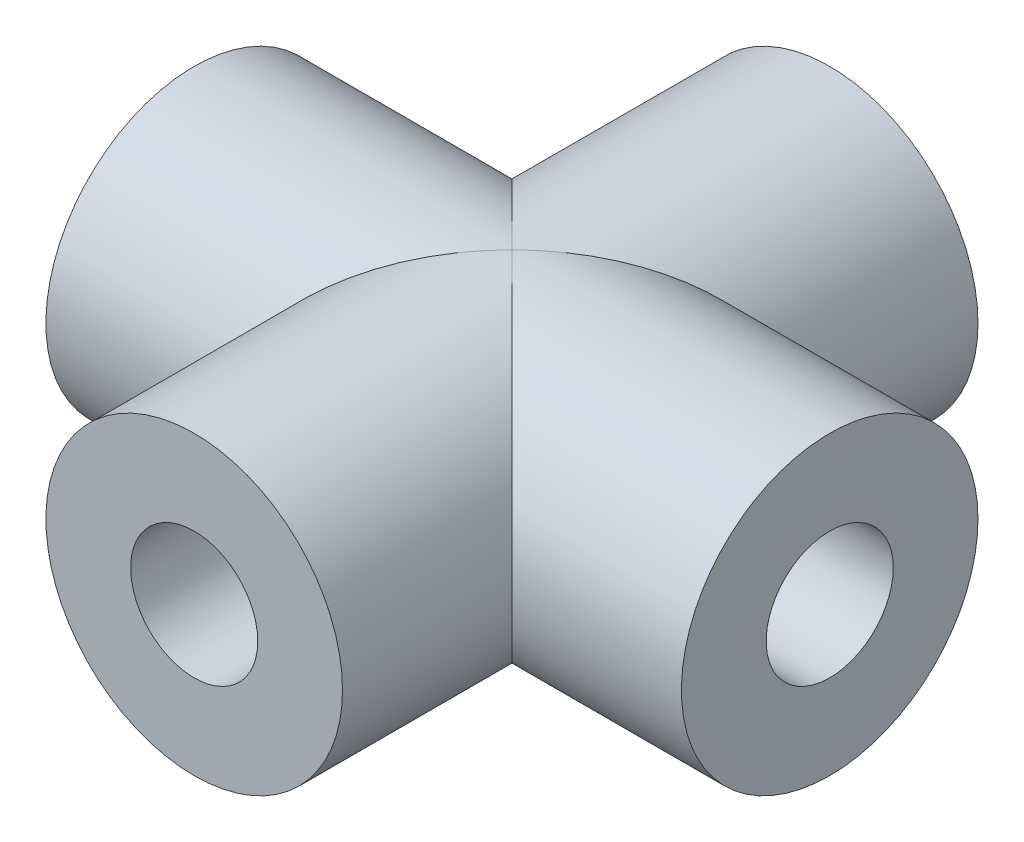
ISO-10303-21;
HEADER;
FILE_DESCRIPTION(('STEP AP214'),'2;1');
FILE_NAME('part.step','',(''),(''),'','','');
FILE_SCHEMA(('AUTOMOTIVE_DESIGN { 1 0 10303 214 1 1 1 1 }'));
ENDSEC;
DATA;
#1=APPLICATION_CONTEXT('core data for automotive mechanical design processes');
#2=APPLICATION_PROTOCOL_DEFINITION('international standard','automotive_design',2000,#1);
#3=PRODUCT_CONTEXT('',#1,'mechanical');
#4=PRODUCT('Part','Part','',(#3));
#5=PRODUCT_RELATED_PRODUCT_CATEGORY('part','',(#4));
#6=PRODUCT_DEFINITION_FORMATION('','',#4);
#7=PRODUCT_DEFINITION_CONTEXT('part definition',#1,'design');
#8=PRODUCT_DEFINITION('design','',#6,#7);
#9=PRODUCT_DEFINITION_SHAPE('','',#8);
#10=(LENGTH_UNIT() NAMED_UNIT(*) SI_UNIT(.MILLI.,.METRE.));
#11=(NAMED_UNIT(*) PLANE_ANGLE_UNIT() SI_UNIT($,.RADIAN.));
#12=(NAMED_UNIT(*) SI_UNIT($,.STERADIAN.) SOLID_ANGLE_UNIT());
#13=UNCERTAINTY_MEASURE_WITH_UNIT(LENGTH_MEASURE(1.E-05),#10,'distance_accuracy_value','');
#14=(GEOMETRIC_REPRESENTATION_CONTEXT(3) GLOBAL_UNCERTAINTY_ASSIGNED_CONTEXT((#13)) GLOBAL_UNIT_ASSIGNED_CONTEXT((#10,
#11,#12)) REPRESENTATION_CONTEXT('',''));
#15=CARTESIAN_POINT('',(0.,0.,0.));
#16=DIRECTION('',(0.,0.,1.));
#17=DIRECTION('',(1.,0.,0.));
#18=AXIS2_PLACEMENT_3D('',#15,#16,#17);
#19=CARTESIAN_POINT('',(0.,0.,15.));
#20=DIRECTION('',(0.,0.,-1.));
#21=DIRECTION('',(-1.,0.,0.));
#22=AXIS2_PLACEMENT_3D('',#19,#20,#21);
#23=CYLINDRICAL_SURFACE('',#22,7.);
#24=CARTESIAN_POINT('',(0.,0.,15.));
#25=DIRECTION('',(0.,0.,1.));
#26=DIRECTION('',(1.,0.,0.));
#27=AXIS2_PLACEMENT_3D('',#24,#25,#26);
#28=CIRCLE('',#27,7.);
#29=CARTESIAN_POINT('',(7.,0.,15.));
#30=VERTEX_POINT('',#29);
#31=EDGE_CURVE('E56',#30,#30,#28,.T.);
#32=ORIENTED_EDGE('',*,*,#31,.F.);
#33=EDGE_LOOP('',(#32));
#34=FACE_BOUND('',#33,.T.);
#35=CARTESIAN_POINT('',(0.,0.,0.));
#36=DIRECTION('',(-0.707106781186547,0.,-0.707106781186547));
#37=DIRECTION('',(0.707106781186547,0.,-0.707106781186547));
#38=AXIS2_PLACEMENT_3D('',#35,#36,#37);
#39=ELLIPSE('',#38,9.89949493661167,7.);
#40=CARTESIAN_POINT('',(0.,-7.,0.));
#41=VERTEX_POINT('',#40);
#42=CARTESIAN_POINT('',(0.,7.,0.));
#43=VERTEX_POINT('',#42);
#44=EDGE_CURVE('E40',#41,#43,#39,.T.);
#45=ORIENTED_EDGE('',*,*,#44,.F.);
#46=CARTESIAN_POINT('',(0.,0.,0.));
#47=DIRECTION('',(0.707106781186547,0.,-0.707106781186547));
#48=DIRECTION('',(-0.707106781186547,0.,-0.707106781186547));
#49=AXIS2_PLACEMENT_3D('',#46,#47,#48);
#50=ELLIPSE('',#49,9.89949493661167,7.);
#51=EDGE_CURVE('E52',#43,#41,#50,.T.);
#52=ORIENTED_EDGE('',*,*,#51,.F.);
#53=EDGE_LOOP('',(#45,#52));
#54=FACE_BOUND('',#53,.T.);
#55=ADVANCED_FACE('F32',(#34,#54),#23,.T.);
#56=CARTESIAN_POINT('',(0.,0.,15.));
#57=DIRECTION('',(0.,0.,1.));
#58=DIRECTION('',(1.,0.,0.));
#59=AXIS2_PLACEMENT_3D('',#56,#57,#58);
#60=PLANE('',#59);
#61=CARTESIAN_POINT('',(0.,0.,15.));
#62=DIRECTION('',(0.,0.,1.));
#63=DIRECTION('',(1.,0.,0.));
#64=AXIS2_PLACEMENT_3D('',#61,#62,#63);
#65=CIRCLE('',#64,3.);
#66=CARTESIAN_POINT('',(3.,0.,15.));
#67=VERTEX_POINT('',#66);
#68=EDGE_CURVE('E101',#67,#67,#65,.T.);
#69=ORIENTED_EDGE('',*,*,#68,.F.);
#70=EDGE_LOOP('',(#69));
#71=FACE_BOUND('',#70,.T.);
#72=ORIENTED_EDGE('',*,*,#31,.T.);
#73=EDGE_LOOP('',(#72));
#74=FACE_BOUND('',#73,.T.);
#75=ADVANCED_FACE('F80',(#71,#74),#60,.T.);
#76=CARTESIAN_POINT('',(-15.,0.,0.));
#77=DIRECTION('',(1.,0.,0.));
#78=DIRECTION('',(0.,0.,-1.));
#79=AXIS2_PLACEMENT_3D('',#76,#77,#78);
#80=PLANE('',#79);
#81=CARTESIAN_POINT('',(-15.,0.,0.));
#82=DIRECTION('',(-1.,0.,0.));
#83=DIRECTION('',(0.,0.,1.));
#84=AXIS2_PLACEMENT_3D('',#81,#82,#83);
#85=CIRCLE('',#84,3.);
#86=CARTESIAN_POINT('',(-15.,0.,2.99999999999995));
#87=VERTEX_POINT('',#86);
#88=EDGE_CURVE('E119',#87,#87,#85,.T.);
#89=ORIENTED_EDGE('',*,*,#88,.F.);
#90=EDGE_LOOP('',(#89));
#91=FACE_BOUND('',#90,.T.);
#92=CARTESIAN_POINT('',(-15.,0.,0.));
#93=DIRECTION('',(1.,0.,0.));
#94=DIRECTION('',(0.,0.,-1.));
#95=AXIS2_PLACEMENT_3D('',#92,#93,#94);
#96=CIRCLE('',#95,7.);
#97=CARTESIAN_POINT('',(-15.,0.,-7.));
#98=VERTEX_POINT('',#97);
#99=EDGE_CURVE('E95',#98,#98,#96,.T.);
#100=ORIENTED_EDGE('',*,*,#99,.F.);
#101=EDGE_LOOP('',(#100));
#102=FACE_BOUND('',#101,.T.);
#103=ADVANCED_FACE('F77',(#91,#102),#80,.F.);
#104=CARTESIAN_POINT('',(15.,0.,0.));
#105=DIRECTION('',(-1.,0.,0.));
#106=DIRECTION('',(0.,0.,1.));
#107=AXIS2_PLACEMENT_3D('',#104,#105,#106);
#108=CYLINDRICAL_SURFACE('',#107,7.);
#109=ORIENTED_EDGE('',*,*,#99,.T.);
#110=EDGE_LOOP('',(#109));
#111=FACE_BOUND('',#110,.T.);
#112=CARTESIAN_POINT('',(0.,0.,0.));
#113=DIRECTION('',(0.707106781186547,0.,-0.707106781186547));
#114=DIRECTION('',(-0.707106781186547,0.,-0.707106781186547));
#115=AXIS2_PLACEMENT_3D('',#112,#113,#114);
#116=ELLIPSE('',#115,9.89949493661167,7.);
#117=EDGE_CURVE('E46',#43,#41,#116,.F.);
#118=ORIENTED_EDGE('',*,*,#117,.T.);
#119=ORIENTED_EDGE('',*,*,#44,.T.);
#120=EDGE_LOOP('',(#118,#119));
#121=FACE_BOUND('',#120,.T.);
#122=ADVANCED_FACE('F58',(#111,#121),#108,.T.);
#123=CARTESIAN_POINT('',(0.,0.,-15.));
#124=DIRECTION('',(0.,0.,1.));
#125=DIRECTION('',(1.,0.,0.));
#126=AXIS2_PLACEMENT_3D('',#123,#124,#125);
#127=PLANE('',#126);
#128=CARTESIAN_POINT('',(0.,0.,-15.));
#129=DIRECTION('',(0.,0.,-1.));
#130=DIRECTION('',(-1.,0.,0.));
#131=AXIS2_PLACEMENT_3D('',#128,#129,#130);
#132=CIRCLE('',#131,3.);
#133=CARTESIAN_POINT('',(-3.,0.,-15.));
#134=VERTEX_POINT('',#133);
#135=EDGE_CURVE('E113',#134,#134,#132,.T.);
#136=ORIENTED_EDGE('',*,*,#135,.F.);
#137=EDGE_LOOP('',(#136));
#138=FACE_BOUND('',#137,.T.);
#139=CARTESIAN_POINT('',(0.,0.,-15.));
#140=DIRECTION('',(0.,0.,1.));
#141=DIRECTION('',(1.,0.,0.));
#142=AXIS2_PLACEMENT_3D('',#139,#140,#141);
#143=CIRCLE('',#142,7.);
#144=CARTESIAN_POINT('',(7.,0.,-15.));
#145=VERTEX_POINT('',#144);
#146=EDGE_CURVE('E89',#145,#145,#143,.T.);
#147=ORIENTED_EDGE('',*,*,#146,.F.);
#148=EDGE_LOOP('',(#147));
#149=FACE_BOUND('',#148,.T.);
#150=ADVANCED_FACE('F71',(#138,#149),#127,.F.);
#151=ORIENTED_EDGE('',*,*,#146,.T.);
#152=EDGE_LOOP('',(#151));
#153=FACE_BOUND('',#152,.T.);
#154=CARTESIAN_POINT('',(0.,0.,0.));
#155=DIRECTION('',(-0.707106781186547,0.,-0.707106781186547));
#156=DIRECTION('',(0.707106781186547,0.,-0.707106781186547));
#157=AXIS2_PLACEMENT_3D('',#154,#155,#156);
#158=ELLIPSE('',#157,9.89949493661167,7.);
#159=EDGE_CURVE('E11',#41,#43,#158,.F.);
#160=ORIENTED_EDGE('',*,*,#159,.F.);
#161=ORIENTED_EDGE('',*,*,#117,.F.);
#162=EDGE_LOOP('',(#160,#161));
#163=FACE_BOUND('',#162,.T.);
#164=ADVANCED_FACE('F34',(#153,#163),#23,.T.);
#165=CARTESIAN_POINT('',(15.,0.,0.));
#166=DIRECTION('',(1.,0.,0.));
#167=DIRECTION('',(0.,0.,-1.));
#168=AXIS2_PLACEMENT_3D('',#165,#166,#167);
#169=CIRCLE('',#168,7.);
#170=CARTESIAN_POINT('',(15.,0.,-7.));
#171=VERTEX_POINT('',#170);
#172=EDGE_CURVE('E92',#171,#171,#169,.T.);
#173=ORIENTED_EDGE('',*,*,#172,.F.);
#174=EDGE_LOOP('',(#173));
#175=FACE_BOUND('',#174,.T.);
#176=ORIENTED_EDGE('',*,*,#51,.T.);
#177=ORIENTED_EDGE('',*,*,#159,.T.);
#178=EDGE_LOOP('',(#176,#177));
#179=FACE_BOUND('',#178,.T.);
#180=ADVANCED_FACE('F59',(#175,#179),#108,.T.);
#181=CARTESIAN_POINT('',(15.,0.,0.));
#182=DIRECTION('',(1.,0.,0.));
#183=DIRECTION('',(0.,0.,-1.));
#184=AXIS2_PLACEMENT_3D('',#181,#182,#183);
#185=PLANE('',#184);
#186=CARTESIAN_POINT('',(15.,0.,1.57116660247941E-13));
#187=DIRECTION('',(1.,0.,0.));
#188=DIRECTION('',(0.,0.,-1.));
#189=AXIS2_PLACEMENT_3D('',#186,#187,#188);
#190=CIRCLE('',#189,3.);
#191=CARTESIAN_POINT('',(15.,0.,-2.99999999999984));
#192=VERTEX_POINT('',#191);
#193=EDGE_CURVE('E107',#192,#192,#190,.T.);
#194=ORIENTED_EDGE('',*,*,#193,.F.);
#195=EDGE_LOOP('',(#194));
#196=FACE_BOUND('',#195,.T.);
#197=ORIENTED_EDGE('',*,*,#172,.T.);
#198=EDGE_LOOP('',(#197));
#199=FACE_BOUND('',#198,.T.);
#200=ADVANCED_FACE('F61',(#196,#199),#185,.T.);
#201=CARTESIAN_POINT('',(0.,0.,9.375));
#202=DIRECTION('',(0.,0.,1.));
#203=DIRECTION('',(1.,0.,0.));
#204=AXIS2_PLACEMENT_3D('',#201,#202,#203);
#205=CYLINDRICAL_SURFACE('',#204,3.);
#206=CARTESIAN_POINT('',(0.,0.,9.375));
#207=DIRECTION('',(0.,0.,1.));
#208=DIRECTION('',(1.,0.,0.));
#209=AXIS2_PLACEMENT_3D('',#206,#207,#208);
#210=CIRCLE('',#209,3.);
#211=CARTESIAN_POINT('',(3.,0.,9.375));
#212=VERTEX_POINT('',#211);
#213=EDGE_CURVE('E98',#212,#212,#210,.T.);
#214=CARTESIAN_POINT('',(3.,0.,9.375));
#215=CARTESIAN_POINT('',(3.,0.,9.43359375));
#216=CARTESIAN_POINT('',(3.,0.,9.4921875));
#217=CARTESIAN_POINT('',(3.,0.,9.609375));
#218=CARTESIAN_POINT('',(3.,0.,9.66796875));
#219=CARTESIAN_POINT('',(3.,0.,9.78515625));
#220=CARTESIAN_POINT('',(3.,0.,9.84375));
#221=CARTESIAN_POINT('',(3.,0.,9.9609375));
#222=CARTESIAN_POINT('',(3.,0.,10.01953125));
#223=CARTESIAN_POINT('',(3.,0.,10.13671875));
#224=CARTESIAN_POINT('',(3.,0.,10.1953125));
#225=CARTESIAN_POINT('',(3.,0.,10.3125));
#226=CARTESIAN_POINT('',(3.,0.,10.37109375));
#227=CARTESIAN_POINT('',(3.,0.,10.48828125));
#228=CARTESIAN_POINT('',(3.,0.,10.546875));
#229=CARTESIAN_POINT('',(3.,0.,10.6640625));
#230=CARTESIAN_POINT('',(3.,0.,10.72265625));
#231=CARTESIAN_POINT('',(3.,0.,10.83984375));
#232=CARTESIAN_POINT('',(3.,0.,10.8984375));
#233=CARTESIAN_POINT('',(3.,0.,11.015625));
#234=CARTESIAN_POINT('',(3.,0.,11.07421875));
#235=CARTESIAN_POINT('',(3.,0.,11.19140625));
#236=CARTESIAN_POINT('',(3.,0.,11.25));
#237=CARTESIAN_POINT('',(3.,0.,11.3671875));
#238=CARTESIAN_POINT('',(3.,0.,11.42578125));
#239=CARTESIAN_POINT('',(3.,0.,11.54296875));
#240=CARTESIAN_POINT('',(3.,0.,11.6015625));
#241=CARTESIAN_POINT('',(3.,0.,11.71875));
#242=CARTESIAN_POINT('',(3.,0.,11.77734375));
#243=CARTESIAN_POINT('',(3.,0.,11.89453125));
#244=CARTESIAN_POINT('',(3.,0.,11.953125));
#245=CARTESIAN_POINT('',(3.,0.,12.0703125));
#246=CARTESIAN_POINT('',(3.,0.,12.12890625));
#247=CARTESIAN_POINT('',(3.,0.,12.24609375));
#248=CARTESIAN_POINT('',(3.,0.,12.3046875));
#249=CARTESIAN_POINT('',(3.,0.,12.421875));
#250=CARTESIAN_POINT('',(3.,0.,12.48046875));
#251=CARTESIAN_POINT('',(3.,0.,12.59765625));
#252=CARTESIAN_POINT('',(3.,0.,12.65625));
#253=CARTESIAN_POINT('',(3.,0.,12.7734375));
#254=CARTESIAN_POINT('',(3.,0.,12.83203125));
#255=CARTESIAN_POINT('',(3.,0.,12.94921875));
#256=CARTESIAN_POINT('',(3.,0.,13.0078125));
#257=CARTESIAN_POINT('',(3.,0.,13.125));
#258=CARTESIAN_POINT('',(3.,0.,13.18359375));
#259=CARTESIAN_POINT('',(3.,0.,13.30078125));
#260=CARTESIAN_POINT('',(3.,0.,13.359375));
#261=CARTESIAN_POINT('',(3.,0.,13.4765625));
#262=CARTESIAN_POINT('',(3.,0.,13.53515625));
#263=CARTESIAN_POINT('',(3.,0.,13.65234375));
#264=CARTESIAN_POINT('',(3.,0.,13.7109375));
#265=CARTESIAN_POINT('',(3.,0.,13.828125));
#266=CARTESIAN_POINT('',(3.,0.,13.88671875));
#267=CARTESIAN_POINT('',(3.,0.,14.00390625));
#268=CARTESIAN_POINT('',(3.,0.,14.0625));
#269=CARTESIAN_POINT('',(3.,0.,14.1796875));
#270=CARTESIAN_POINT('',(3.,0.,14.23828125));
#271=CARTESIAN_POINT('',(3.,0.,14.35546875));
#272=CARTESIAN_POINT('',(3.,0.,14.4140625));
#273=CARTESIAN_POINT('',(3.,0.,14.53125));
#274=CARTESIAN_POINT('',(3.,0.,14.58984375));
#275=CARTESIAN_POINT('',(3.,0.,14.70703125));
#276=CARTESIAN_POINT('',(3.,0.,14.765625));
#277=CARTESIAN_POINT('',(3.,0.,14.8828125));
#278=CARTESIAN_POINT('',(3.,0.,14.94140625));
#279=CARTESIAN_POINT('',(3.,0.,15.));
#280=B_SPLINE_CURVE_WITH_KNOTS('',3,(#214,#215,#216,#217,#218,#219,#220,#221,#222,#223,#224,
#225,#226,#227,#228,#229,#230,#231,#232,#233,#234,#235,#236,#237,#238,#239,#240,#241,#242,#243,
#244,#245,#246,#247,#248,#249,#250,#251,#252,#253,#254,#255,#256,#257,#258,#259,#260,#261,#262,
#263,#264,#265,#266,#267,#268,#269,#270,#271,#272,#273,#274,#275,#276,#277,#278,#279),
.UNSPECIFIED.,.F.,.F.,(4,2,2,2,2,2,2,2,2,2,2,2,2,2,2,2,2,2,2,2,2,2,2,2,2,2,2,2,2,2,2,2,4),(0.,
0.17578125,0.351562499999999,0.527343749999999,0.703124999999999,0.878906249999999,1.0546875,
1.23046875,1.40625,1.58203125,1.7578125,1.93359375,2.109375,2.28515625,2.4609375,2.63671875,
2.8125,2.98828125,3.1640625,3.33984375,3.515625,3.69140625,3.8671875,4.04296875,4.21875,
4.39453125,4.5703125,4.74609375,4.921875,5.09765625,5.2734375,5.44921875,5.625),.UNSPECIFIED.);
#281=EDGE_CURVE('BSEAM68',#212,#67,#280,.T.);
#282=ORIENTED_EDGE('',*,*,#213,.F.);
#283=ORIENTED_EDGE('',*,*,#68,.T.);
#284=ORIENTED_EDGE('',*,*,#281,.T.);
#285=ORIENTED_EDGE('',*,*,#281,.F.);
#286=EDGE_LOOP('',(#282,#284,#283,#285));
#287=FACE_BOUND('',#286,.T.);
#288=ADVANCED_FACE('F68',(#287),#205,.F.);
#289=CARTESIAN_POINT('',(0.,0.,9.375));
#290=DIRECTION('',(0.,0.,1.));
#291=DIRECTION('',(1.,0.,0.));
#292=AXIS2_PLACEMENT_3D('',#289,#290,#291);
#293=PLANE('',#292);
#294=ORIENTED_EDGE('',*,*,#213,.T.);
#295=EDGE_LOOP('',(#294));
#296=FACE_BOUND('',#295,.T.);
#297=ADVANCED_FACE('F142',(#296),#293,.T.);
#298=CARTESIAN_POINT('',(9.375,0.,0.));
#299=DIRECTION('',(1.,0.,0.));
#300=DIRECTION('',(0.,0.,-1.));
#301=AXIS2_PLACEMENT_3D('',#298,#299,#300);
#302=CYLINDRICAL_SURFACE('',#301,3.);
#303=CARTESIAN_POINT('',(9.375,0.,0.));
#304=DIRECTION('',(1.,0.,0.));
#305=DIRECTION('',(0.,0.,-1.));
#306=AXIS2_PLACEMENT_3D('',#303,#304,#305);
#307=CIRCLE('',#306,3.);
#308=CARTESIAN_POINT('',(9.37500000000003,0.,-2.9999999999999));
#309=VERTEX_POINT('',#308);
#310=EDGE_CURVE('E110',#309,#309,#307,.T.);
#311=CARTESIAN_POINT('',(9.37500000000003,0.,-2.9999999999999));
#312=CARTESIAN_POINT('',(9.43359375000003,0.,-2.9999999999999));
#313=CARTESIAN_POINT('',(9.49218750000003,0.,-2.9999999999999));
#314=CARTESIAN_POINT('',(9.60937500000003,0.,-2.9999999999999));
#315=CARTESIAN_POINT('',(9.66796875000003,0.,-2.9999999999999));
#316=CARTESIAN_POINT('',(9.78515625000003,0.,-2.9999999999999));
#317=CARTESIAN_POINT('',(9.84375000000003,0.,-2.9999999999999));
#318=CARTESIAN_POINT('',(9.96093750000003,0.,-2.9999999999999));
#319=CARTESIAN_POINT('',(10.01953125,0.,-2.9999999999999));
#320=CARTESIAN_POINT('',(10.13671875,0.,-2.99999999999989));
#321=CARTESIAN_POINT('',(10.1953125,0.,-2.99999999999989));
#322=CARTESIAN_POINT('',(10.3125,0.,-2.99999999999989));
#323=CARTESIAN_POINT('',(10.37109375,0.,-2.99999999999989));
#324=CARTESIAN_POINT('',(10.48828125,0.,-2.99999999999989));
#325=CARTESIAN_POINT('',(10.546875,0.,-2.99999999999989));
#326=CARTESIAN_POINT('',(10.6640625,0.,-2.99999999999989));
#327=CARTESIAN_POINT('',(10.72265625,0.,-2.99999999999989));
#328=CARTESIAN_POINT('',(10.83984375,0.,-2.99999999999989));
#329=CARTESIAN_POINT('',(10.8984375,0.,-2.99999999999989));
#330=CARTESIAN_POINT('',(11.015625,0.,-2.99999999999989));
#331=CARTESIAN_POINT('',(11.07421875,0.,-2.99999999999988));
#332=CARTESIAN_POINT('',(11.19140625,0.,-2.99999999999988));
#333=CARTESIAN_POINT('',(11.25,0.,-2.99999999999988));
#334=CARTESIAN_POINT('',(11.3671875,0.,-2.99999999999988));
#335=CARTESIAN_POINT('',(11.42578125,0.,-2.99999999999988));
#336=CARTESIAN_POINT('',(11.54296875,0.,-2.99999999999988));
#337=CARTESIAN_POINT('',(11.6015625,0.,-2.99999999999988));
#338=CARTESIAN_POINT('',(11.71875,0.,-2.99999999999988));
#339=CARTESIAN_POINT('',(11.77734375,0.,-2.99999999999988));
#340=CARTESIAN_POINT('',(11.89453125,0.,-2.99999999999988));
#341=CARTESIAN_POINT('',(11.953125,0.,-2.99999999999988));
#342=CARTESIAN_POINT('',(12.0703125,0.,-2.99999999999987));
#343=CARTESIAN_POINT('',(12.12890625,0.,-2.99999999999987));
#344=CARTESIAN_POINT('',(12.24609375,0.,-2.99999999999987));
#345=CARTESIAN_POINT('',(12.3046875,0.,-2.99999999999987));
#346=CARTESIAN_POINT('',(12.421875,0.,-2.99999999999987));
#347=CARTESIAN_POINT('',(12.48046875,0.,-2.99999999999987));
#348=CARTESIAN_POINT('',(12.59765625,0.,-2.99999999999987));
#349=CARTESIAN_POINT('',(12.65625,0.,-2.99999999999987));
#350=CARTESIAN_POINT('',(12.7734375,0.,-2.99999999999987));
#351=CARTESIAN_POINT('',(12.83203125,0.,-2.99999999999987));
#352=CARTESIAN_POINT('',(12.94921875,0.,-2.99999999999986));
#353=CARTESIAN_POINT('',(13.0078125,0.,-2.99999999999986));
#354=CARTESIAN_POINT('',(13.125,0.,-2.99999999999986));
#355=CARTESIAN_POINT('',(13.18359375,0.,-2.99999999999986));
#356=CARTESIAN_POINT('',(13.30078125,0.,-2.99999999999986));
#357=CARTESIAN_POINT('',(13.359375,0.,-2.99999999999986));
#358=CARTESIAN_POINT('',(13.4765625,0.,-2.99999999999986));
#359=CARTESIAN_POINT('',(13.53515625,0.,-2.99999999999986));
#360=CARTESIAN_POINT('',(13.65234375,0.,-2.99999999999986));
#361=CARTESIAN_POINT('',(13.7109375,0.,-2.99999999999986));
#362=CARTESIAN_POINT('',(13.828125,0.,-2.99999999999986));
#363=CARTESIAN_POINT('',(13.88671875,0.,-2.99999999999986));
#364=CARTESIAN_POINT('',(14.00390625,0.,-2.99999999999985));
#365=CARTESIAN_POINT('',(14.0625,0.,-2.99999999999985));
#366=CARTESIAN_POINT('',(14.1796875,0.,-2.99999999999985));
#367=CARTESIAN_POINT('',(14.23828125,0.,-2.99999999999985));
#368=CARTESIAN_POINT('',(14.35546875,0.,-2.99999999999985));
#369=CARTESIAN_POINT('',(14.4140625,0.,-2.99999999999985));
#370=CARTESIAN_POINT('',(14.53125,0.,-2.99999999999985));
#371=CARTESIAN_POINT('',(14.58984375,0.,-2.99999999999985));
#372=CARTESIAN_POINT('',(14.70703125,0.,-2.99999999999985));
#373=CARTESIAN_POINT('',(14.765625,0.,-2.99999999999985));
#374=CARTESIAN_POINT('',(14.8828125,0.,-2.99999999999984));
#375=CARTESIAN_POINT('',(14.94140625,0.,-2.99999999999984));
#376=CARTESIAN_POINT('',(15.,0.,-2.99999999999984));
#377=B_SPLINE_CURVE_WITH_KNOTS('',3,(#311,#312,#313,#314,#315,#316,#317,#318,#319,#320,#321,
#322,#323,#324,#325,#326,#327,#328,#329,#330,#331,#332,#333,#334,#335,#336,#337,#338,#339,#340,
#341,#342,#343,#344,#345,#346,#347,#348,#349,#350,#351,#352,#353,#354,#355,#356,#357,#358,#359,
#360,#361,#362,#363,#364,#365,#366,#367,#368,#369,#370,#371,#372,#373,#374,#375,#376),
.UNSPECIFIED.,.F.,.F.,(4,2,2,2,2,2,2,2,2,2,2,2,2,2,2,2,2,2,2,2,2,2,2,2,2,2,2,2,2,2,2,2,4),(0.,
0.175781250000001,0.351562500000001,0.527343750000001,0.703125000000001,0.87890625,1.0546875,
1.23046875,1.40625,1.58203125,1.7578125,1.93359375,2.109375,2.28515625,2.4609375,2.63671875,
2.8125,2.98828125,3.1640625,3.33984375,3.515625,3.69140625,3.8671875,4.04296875,4.21875,
4.39453125,4.5703125,4.74609375,4.921875,5.09765625,5.2734375,5.44921875,5.625),.UNSPECIFIED.);
#378=EDGE_CURVE('BSEAM146',#309,#192,#377,.T.);
#379=ORIENTED_EDGE('',*,*,#310,.F.);
#380=ORIENTED_EDGE('',*,*,#193,.T.);
#381=ORIENTED_EDGE('',*,*,#378,.T.);
#382=ORIENTED_EDGE('',*,*,#378,.F.);
#383=EDGE_LOOP('',(#379,#381,#380,#382));
#384=FACE_BOUND('',#383,.T.);
#385=ADVANCED_FACE('F146',(#384),#302,.F.);
#386=CARTESIAN_POINT('',(9.375,0.,0.));
#387=DIRECTION('',(1.,0.,0.));
#388=DIRECTION('',(0.,0.,-1.));
#389=AXIS2_PLACEMENT_3D('',#386,#387,#388);
#390=PLANE('',#389);
#391=ORIENTED_EDGE('',*,*,#310,.T.);
#392=EDGE_LOOP('',(#391));
#393=FACE_BOUND('',#392,.T.);
#394=ADVANCED_FACE('F150',(#393),#390,.T.);
#395=CARTESIAN_POINT('',(0.,0.,-9.375));
#396=DIRECTION('',(0.,0.,-1.));
#397=DIRECTION('',(-1.,0.,0.));
#398=AXIS2_PLACEMENT_3D('',#395,#396,#397);
#399=CYLINDRICAL_SURFACE('',#398,3.);
#400=CARTESIAN_POINT('',(0.,0.,-9.375));
#401=DIRECTION('',(0.,0.,-1.));
#402=DIRECTION('',(-1.,0.,0.));
#403=AXIS2_PLACEMENT_3D('',#400,#401,#402);
#404=CIRCLE('',#403,3.);
#405=CARTESIAN_POINT('',(-3.,0.,-9.375));
#406=VERTEX_POINT('',#405);
#407=EDGE_CURVE('E116',#406,#406,#404,.T.);
#408=CARTESIAN_POINT('',(-3.,0.,-9.375));
#409=CARTESIAN_POINT('',(-3.,0.,-9.43359375));
#410=CARTESIAN_POINT('',(-3.,0.,-9.4921875));
#411=CARTESIAN_POINT('',(-3.,0.,-9.609375));
#412=CARTESIAN_POINT('',(-3.,0.,-9.66796875));
#413=CARTESIAN_POINT('',(-3.,0.,-9.78515625));
#414=CARTESIAN_POINT('',(-3.,0.,-9.84375));
#415=CARTESIAN_POINT('',(-3.,0.,-9.9609375));
#416=CARTESIAN_POINT('',(-3.,0.,-10.01953125));
#417=CARTESIAN_POINT('',(-3.,0.,-10.13671875));
#418=CARTESIAN_POINT('',(-3.,0.,-10.1953125));
#419=CARTESIAN_POINT('',(-3.,0.,-10.3125));
#420=CARTESIAN_POINT('',(-3.,0.,-10.37109375));
#421=CARTESIAN_POINT('',(-3.,0.,-10.48828125));
#422=CARTESIAN_POINT('',(-3.,0.,-10.546875));
#423=CARTESIAN_POINT('',(-3.,0.,-10.6640625));
#424=CARTESIAN_POINT('',(-3.,0.,-10.72265625));
#425=CARTESIAN_POINT('',(-3.,0.,-10.83984375));
#426=CARTESIAN_POINT('',(-3.,0.,-10.8984375));
#427=CARTESIAN_POINT('',(-3.,0.,-11.015625));
#428=CARTESIAN_POINT('',(-3.,0.,-11.07421875));
#429=CARTESIAN_POINT('',(-3.,0.,-11.19140625));
#430=CARTESIAN_POINT('',(-3.,0.,-11.25));
#431=CARTESIAN_POINT('',(-3.,0.,-11.3671875));
#432=CARTESIAN_POINT('',(-3.,0.,-11.42578125));
#433=CARTESIAN_POINT('',(-3.,0.,-11.54296875));
#434=CARTESIAN_POINT('',(-3.,0.,-11.6015625));
#435=CARTESIAN_POINT('',(-3.,0.,-11.71875));
#436=CARTESIAN_POINT('',(-3.,0.,-11.77734375));
#437=CARTESIAN_POINT('',(-3.,0.,-11.89453125));
#438=CARTESIAN_POINT('',(-3.,0.,-11.953125));
#439=CARTESIAN_POINT('',(-3.,0.,-12.0703125));
#440=CARTESIAN_POINT('',(-3.,0.,-12.12890625));
#441=CARTESIAN_POINT('',(-3.,0.,-12.24609375));
#442=CARTESIAN_POINT('',(-3.,0.,-12.3046875));
#443=CARTESIAN_POINT('',(-3.,0.,-12.421875));
#444=CARTESIAN_POINT('',(-3.,0.,-12.48046875));
#445=CARTESIAN_POINT('',(-3.,0.,-12.59765625));
#446=CARTESIAN_POINT('',(-3.,0.,-12.65625));
#447=CARTESIAN_POINT('',(-3.,0.,-12.7734375));
#448=CARTESIAN_POINT('',(-3.,0.,-12.83203125));
#449=CARTESIAN_POINT('',(-3.,0.,-12.94921875));
#450=CARTESIAN_POINT('',(-3.,0.,-13.0078125));
#451=CARTESIAN_POINT('',(-3.,0.,-13.125));
#452=CARTESIAN_POINT('',(-3.,0.,-13.18359375));
#453=CARTESIAN_POINT('',(-3.,0.,-13.30078125));
#454=CARTESIAN_POINT('',(-3.,0.,-13.359375));
#455=CARTESIAN_POINT('',(-3.,0.,-13.4765625));
#456=CARTESIAN_POINT('',(-3.,0.,-13.53515625));
#457=CARTESIAN_POINT('',(-3.,0.,-13.65234375));
#458=CARTESIAN_POINT('',(-3.,0.,-13.7109375));
#459=CARTESIAN_POINT('',(-3.,0.,-13.828125));
#460=CARTESIAN_POINT('',(-3.,0.,-13.88671875));
#461=CARTESIAN_POINT('',(-3.,0.,-14.00390625));
#462=CARTESIAN_POINT('',(-3.,0.,-14.0625));
#463=CARTESIAN_POINT('',(-3.,0.,-14.1796875));
#464=CARTESIAN_POINT('',(-3.,0.,-14.23828125));
#465=CARTESIAN_POINT('',(-3.,0.,-14.35546875));
#466=CARTESIAN_POINT('',(-3.,0.,-14.4140625));
#467=CARTESIAN_POINT('',(-3.,0.,-14.53125));
#468=CARTESIAN_POINT('',(-3.,0.,-14.58984375));
#469=CARTESIAN_POINT('',(-3.,0.,-14.70703125));
#470=CARTESIAN_POINT('',(-3.,0.,-14.765625));
#471=CARTESIAN_POINT('',(-3.,0.,-14.8828125));
#472=CARTESIAN_POINT('',(-3.,0.,-14.94140625));
#473=CARTESIAN_POINT('',(-3.,0.,-15.));
#474=B_SPLINE_CURVE_WITH_KNOTS('',3,(#408,#409,#410,#411,#412,#413,#414,#415,#416,#417,#418,
#419,#420,#421,#422,#423,#424,#425,#426,#427,#428,#429,#430,#431,#432,#433,#434,#435,#436,#437,
#438,#439,#440,#441,#442,#443,#444,#445,#446,#447,#448,#449,#450,#451,#452,#453,#454,#455,#456,
#457,#458,#459,#460,#461,#462,#463,#464,#465,#466,#467,#468,#469,#470,#471,#472,#473),
.UNSPECIFIED.,.F.,.F.,(4,2,2,2,2,2,2,2,2,2,2,2,2,2,2,2,2,2,2,2,2,2,2,2,2,2,2,2,2,2,2,2,4),(0.,
0.17578125,0.351562499999999,0.527343749999999,0.703124999999999,0.878906249999999,1.0546875,
1.23046875,1.40625,1.58203125,1.7578125,1.93359375,2.109375,2.28515625,2.4609375,2.63671875,
2.8125,2.98828125,3.1640625,3.33984375,3.515625,3.69140625,3.8671875,4.04296875,4.21875,
4.39453125,4.5703125,4.74609375,4.921875,5.09765625,5.2734375,5.44921875,5.625),.UNSPECIFIED.);
#475=EDGE_CURVE('BSEAM154',#406,#134,#474,.T.);
#476=ORIENTED_EDGE('',*,*,#407,.F.);
#477=ORIENTED_EDGE('',*,*,#135,.T.);
#478=ORIENTED_EDGE('',*,*,#475,.T.);
#479=ORIENTED_EDGE('',*,*,#475,.F.);
#480=EDGE_LOOP('',(#476,#478,#477,#479));
#481=FACE_BOUND('',#480,.T.);
#482=ADVANCED_FACE('F154',(#481),#399,.F.);
#483=CARTESIAN_POINT('',(0.,0.,-9.375));
#484=DIRECTION('',(0.,0.,-1.));
#485=DIRECTION('',(-1.,0.,0.));
#486=AXIS2_PLACEMENT_3D('',#483,#484,#485);
#487=PLANE('',#486);
#488=ORIENTED_EDGE('',*,*,#407,.T.);
#489=EDGE_LOOP('',(#488));
#490=FACE_BOUND('',#489,.T.);
#491=ADVANCED_FACE('F130',(#490),#487,.T.);
#492=CARTESIAN_POINT('',(-9.375,0.,0.));
#493=DIRECTION('',(-1.,0.,0.));
#494=DIRECTION('',(0.,0.,1.));
#495=AXIS2_PLACEMENT_3D('',#492,#493,#494);
#496=CYLINDRICAL_SURFACE('',#495,3.);
#497=CARTESIAN_POINT('',(-9.375,0.,0.));
#498=DIRECTION('',(-1.,0.,0.));
#499=DIRECTION('',(0.,0.,1.));
#500=AXIS2_PLACEMENT_3D('',#497,#498,#499);
#501=CIRCLE('',#500,3.);
#502=CARTESIAN_POINT('',(-9.37500000000001,0.,2.99999999999997));
#503=VERTEX_POINT('',#502);
#504=EDGE_CURVE('E104',#503,#503,#501,.T.);
#505=CARTESIAN_POINT('',(-9.37500000000001,0.,2.99999999999997));
#506=CARTESIAN_POINT('',(-9.43359375000001,0.,2.99999999999997));
#507=CARTESIAN_POINT('',(-9.49218750000001,0.,2.99999999999997));
#508=CARTESIAN_POINT('',(-9.60937500000001,0.,2.99999999999997));
#509=CARTESIAN_POINT('',(-9.66796875000001,0.,2.99999999999997));
#510=CARTESIAN_POINT('',(-9.78515625000001,0.,2.99999999999997));
#511=CARTESIAN_POINT('',(-9.84375000000001,0.,2.99999999999997));
#512=CARTESIAN_POINT('',(-9.96093750000001,0.,2.99999999999997));
#513=CARTESIAN_POINT('',(-10.01953125,0.,2.99999999999997));
#514=CARTESIAN_POINT('',(-10.13671875,0.,2.99999999999996));
#515=CARTESIAN_POINT('',(-10.1953125,0.,2.99999999999996));
#516=CARTESIAN_POINT('',(-10.3125,0.,2.99999999999996));
#517=CARTESIAN_POINT('',(-10.37109375,0.,2.99999999999996));
#518=CARTESIAN_POINT('',(-10.48828125,0.,2.99999999999996));
#519=CARTESIAN_POINT('',(-10.546875,0.,2.99999999999996));
#520=CARTESIAN_POINT('',(-10.6640625,0.,2.99999999999996));
#521=CARTESIAN_POINT('',(-10.72265625,0.,2.99999999999996));
#522=CARTESIAN_POINT('',(-10.83984375,0.,2.99999999999996));
#523=CARTESIAN_POINT('',(-10.8984375,0.,2.99999999999996));
#524=CARTESIAN_POINT('',(-11.015625,0.,2.99999999999996));
#525=CARTESIAN_POINT('',(-11.07421875,0.,2.99999999999996));
#526=CARTESIAN_POINT('',(-11.19140625,0.,2.99999999999996));
#527=CARTESIAN_POINT('',(-11.25,0.,2.99999999999996));
#528=CARTESIAN_POINT('',(-11.3671875,0.,2.99999999999996));
#529=CARTESIAN_POINT('',(-11.42578125,0.,2.99999999999996));
#530=CARTESIAN_POINT('',(-11.54296875,0.,2.99999999999996));
#531=CARTESIAN_POINT('',(-11.6015625,0.,2.99999999999996));
#532=CARTESIAN_POINT('',(-11.71875,0.,2.99999999999996));
#533=CARTESIAN_POINT('',(-11.77734375,0.,2.99999999999996));
#534=CARTESIAN_POINT('',(-11.89453125,0.,2.99999999999996));
#535=CARTESIAN_POINT('',(-11.953125,0.,2.99999999999996));
#536=CARTESIAN_POINT('',(-12.0703125,0.,2.99999999999996));
#537=CARTESIAN_POINT('',(-12.12890625,0.,2.99999999999996));
#538=CARTESIAN_POINT('',(-12.24609375,0.,2.99999999999996));
#539=CARTESIAN_POINT('',(-12.3046875,0.,2.99999999999996));
#540=CARTESIAN_POINT('',(-12.421875,0.,2.99999999999996));
#541=CARTESIAN_POINT('',(-12.48046875,0.,2.99999999999996));
#542=CARTESIAN_POINT('',(-12.59765625,0.,2.99999999999996));
#543=CARTESIAN_POINT('',(-12.65625,0.,2.99999999999996));
#544=CARTESIAN_POINT('',(-12.7734375,0.,2.99999999999996));
#545=CARTESIAN_POINT('',(-12.83203125,0.,2.99999999999996));
#546=CARTESIAN_POINT('',(-12.94921875,0.,2.99999999999996));
#547=CARTESIAN_POINT('',(-13.0078125,0.,2.99999999999996));
#548=CARTESIAN_POINT('',(-13.125,0.,2.99999999999995));
#549=CARTESIAN_POINT('',(-13.18359375,0.,2.99999999999995));
#550=CARTESIAN_POINT('',(-13.30078125,0.,2.99999999999995));
#551=CARTESIAN_POINT('',(-13.359375,0.,2.99999999999995));
#552=CARTESIAN_POINT('',(-13.4765625,0.,2.99999999999995));
#553=CARTESIAN_POINT('',(-13.53515625,0.,2.99999999999995));
#554=CARTESIAN_POINT('',(-13.65234375,0.,2.99999999999995));
#555=CARTESIAN_POINT('',(-13.7109375,0.,2.99999999999995));
#556=CARTESIAN_POINT('',(-13.828125,0.,2.99999999999995));
#557=CARTESIAN_POINT('',(-13.88671875,0.,2.99999999999995));
#558=CARTESIAN_POINT('',(-14.00390625,0.,2.99999999999995));
#559=CARTESIAN_POINT('',(-14.0625,0.,2.99999999999995));
#560=CARTESIAN_POINT('',(-14.1796875,0.,2.99999999999995));
#561=CARTESIAN_POINT('',(-14.23828125,0.,2.99999999999995));
#562=CARTESIAN_POINT('',(-14.35546875,0.,2.99999999999995));
#563=CARTESIAN_POINT('',(-14.4140625,0.,2.99999999999995));
#564=CARTESIAN_POINT('',(-14.53125,0.,2.99999999999995));
#565=CARTESIAN_POINT('',(-14.58984375,0.,2.99999999999995));
#566=CARTESIAN_POINT('',(-14.70703125,0.,2.99999999999995));
#567=CARTESIAN_POINT('',(-14.765625,0.,2.99999999999995));
#568=CARTESIAN_POINT('',(-14.8828125,0.,2.99999999999995));
#569=CARTESIAN_POINT('',(-14.94140625,0.,2.99999999999995));
#570=CARTESIAN_POINT('',(-15.,0.,2.99999999999995));
#571=B_SPLINE_CURVE_WITH_KNOTS('',3,(#505,#506,#507,#508,#509,#510,#511,#512,#513,#514,#515,
#516,#517,#518,#519,#520,#521,#522,#523,#524,#525,#526,#527,#528,#529,#530,#531,#532,#533,#534,
#535,#536,#537,#538,#539,#540,#541,#542,#543,#544,#545,#546,#547,#548,#549,#550,#551,#552,#553,
#554,#555,#556,#557,#558,#559,#560,#561,#562,#563,#564,#565,#566,#567,#568,#569,#570),
.UNSPECIFIED.,.F.,.F.,(4,2,2,2,2,2,2,2,2,2,2,2,2,2,2,2,2,2,2,2,2,2,2,2,2,2,2,2,2,2,2,2,4),(0.,
0.175781250000001,0.351562500000001,0.527343750000001,0.703125000000001,0.87890625,1.0546875,
1.23046875,1.40625,1.58203125,1.7578125,1.93359375,2.109375,2.28515625,2.4609375,2.63671875,
2.8125,2.98828125,3.1640625,3.33984375,3.515625,3.69140625,3.8671875,4.04296875,4.21875,
4.39453125,4.5703125,4.74609375,4.921875,5.09765625,5.2734375,5.44921875,5.625),.UNSPECIFIED.);
#572=EDGE_CURVE('BSEAM127',#503,#87,#571,.T.);
#573=ORIENTED_EDGE('',*,*,#504,.F.);
#574=ORIENTED_EDGE('',*,*,#88,.T.);
#575=ORIENTED_EDGE('',*,*,#572,.T.);
#576=ORIENTED_EDGE('',*,*,#572,.F.);
#577=EDGE_LOOP('',(#573,#575,#574,#576));
#578=FACE_BOUND('',#577,.T.);
#579=ADVANCED_FACE('F127',(#578),#496,.F.);
#580=CARTESIAN_POINT('',(-9.375,0.,0.));
#581=DIRECTION('',(-1.,0.,0.));
#582=DIRECTION('',(0.,0.,1.));
#583=AXIS2_PLACEMENT_3D('',#580,#581,#582);
#584=PLANE('',#583);
#585=ORIENTED_EDGE('',*,*,#504,.T.);
#586=EDGE_LOOP('',(#585));
#587=FACE_BOUND('',#586,.T.);
#588=ADVANCED_FACE('F125',(#587),#584,.T.);
#589=CLOSED_SHELL('',(#55,#75,#103,#122,#150,#164,#180,#200,#288,#297,#385,#394,#482,#491,#579,#588));
#590=MANIFOLD_SOLID_BREP('B2',#589);
#591=ADVANCED_BREP_SHAPE_REPRESENTATION('',(#18,#590),#14);
#592=SHAPE_DEFINITION_REPRESENTATION(#9,#591);
ENDSEC;
END-ISO-10303-21;
